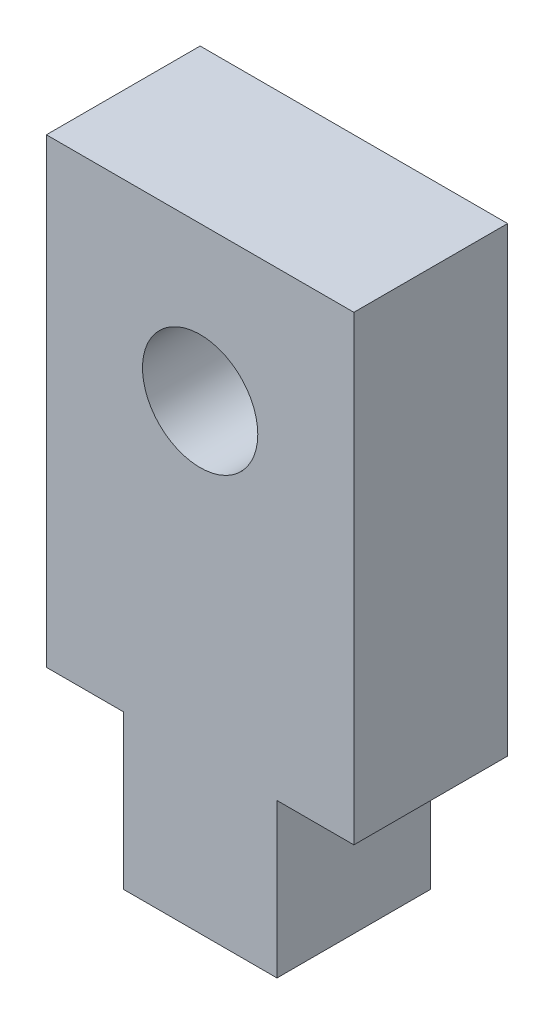
ISO-10303-21;
HEADER;
FILE_DESCRIPTION(('STEP AP214'),'2;1');
FILE_NAME('part.step','',(''),(''),'','','');
FILE_SCHEMA(('AUTOMOTIVE_DESIGN { 1 0 10303 214 1 1 1 1 }'));
ENDSEC;
DATA;
#1=APPLICATION_CONTEXT('core data for automotive mechanical design processes');
#2=APPLICATION_PROTOCOL_DEFINITION('international standard','automotive_design',2000,#1);
#3=PRODUCT_CONTEXT('',#1,'mechanical');
#4=PRODUCT('Part','Part','',(#3));
#5=PRODUCT_RELATED_PRODUCT_CATEGORY('part','',(#4));
#6=PRODUCT_DEFINITION_FORMATION('','',#4);
#7=PRODUCT_DEFINITION_CONTEXT('part definition',#1,'design');
#8=PRODUCT_DEFINITION('design','',#6,#7);
#9=PRODUCT_DEFINITION_SHAPE('','',#8);
#10=(LENGTH_UNIT() NAMED_UNIT(*) SI_UNIT(.MILLI.,.METRE.));
#11=(NAMED_UNIT(*) PLANE_ANGLE_UNIT() SI_UNIT($,.RADIAN.));
#12=(NAMED_UNIT(*) SI_UNIT($,.STERADIAN.) SOLID_ANGLE_UNIT());
#13=UNCERTAINTY_MEASURE_WITH_UNIT(LENGTH_MEASURE(1.E-05),#10,'distance_accuracy_value','');
#14=(GEOMETRIC_REPRESENTATION_CONTEXT(3) GLOBAL_UNCERTAINTY_ASSIGNED_CONTEXT((#13)) GLOBAL_UNIT_ASSIGNED_CONTEXT((#10,
#11,#12)) REPRESENTATION_CONTEXT('',''));
#15=CARTESIAN_POINT('',(0.,0.,0.));
#16=DIRECTION('',(0.,0.,1.));
#17=DIRECTION('',(1.,0.,0.));
#18=AXIS2_PLACEMENT_3D('',#15,#16,#17);
#19=CARTESIAN_POINT('',(0.,0.,5.));
#20=DIRECTION('',(0.,0.,1.));
#21=DIRECTION('',(1.,0.,0.));
#22=AXIS2_PLACEMENT_3D('',#19,#20,#21);
#23=PLANE('',#22);
#24=DIRECTION('',(0.,1.,0.));
#25=VECTOR('',#24,1.);
#26=CARTESIAN_POINT('',(5.00000000000001,7.5,5.));
#27=LINE('',#26,#25);
#28=CARTESIAN_POINT('',(5.,-7.5,5.));
#29=VERTEX_POINT('',#28);
#30=CARTESIAN_POINT('',(5.00000000000001,7.5,5.));
#31=VERTEX_POINT('',#30);
#32=EDGE_CURVE('E145',#29,#31,#27,.T.);
#33=ORIENTED_EDGE('',*,*,#32,.T.);
#34=DIRECTION('',(-1.,0.,0.));
#35=VECTOR('',#34,1.);
#36=CARTESIAN_POINT('',(-5.,7.5,5.));
#37=LINE('',#36,#35);
#38=CARTESIAN_POINT('',(-5.,7.5,5.));
#39=VERTEX_POINT('',#38);
#40=EDGE_CURVE('E93',#31,#39,#37,.T.);
#41=ORIENTED_EDGE('',*,*,#40,.T.);
#42=DIRECTION('',(0.,-1.,0.));
#43=VECTOR('',#42,1.);
#44=CARTESIAN_POINT('',(-5.,7.5,5.));
#45=LINE('',#44,#43);
#46=CARTESIAN_POINT('',(-5.00000000000001,-7.5,5.));
#47=VERTEX_POINT('',#46);
#48=EDGE_CURVE('E160',#39,#47,#45,.T.);
#49=ORIENTED_EDGE('',*,*,#48,.T.);
#50=DIRECTION('',(1.,0.,0.));
#51=VECTOR('',#50,1.);
#52=CARTESIAN_POINT('',(-5.00000000000001,-7.5,5.));
#53=LINE('',#52,#51);
#54=CARTESIAN_POINT('',(-2.5,-7.5,5.));
#55=VERTEX_POINT('',#54);
#56=EDGE_CURVE('E173',#47,#55,#53,.T.);
#57=ORIENTED_EDGE('',*,*,#56,.T.);
#58=DIRECTION('',(0.,-1.,0.));
#59=VECTOR('',#58,1.);
#60=CARTESIAN_POINT('',(-2.5,-12.5,5.));
#61=LINE('',#60,#59);
#62=CARTESIAN_POINT('',(-2.5,-12.5,5.));
#63=VERTEX_POINT('',#62);
#64=EDGE_CURVE('E112',#55,#63,#61,.T.);
#65=ORIENTED_EDGE('',*,*,#64,.T.);
#66=DIRECTION('',(1.,0.,0.));
#67=VECTOR('',#66,1.);
#68=CARTESIAN_POINT('',(-2.5,-12.5,5.));
#69=LINE('',#68,#67);
#70=CARTESIAN_POINT('',(2.5,-12.5,5.));
#71=VERTEX_POINT('',#70);
#72=EDGE_CURVE('E106',#63,#71,#69,.T.);
#73=ORIENTED_EDGE('',*,*,#72,.T.);
#74=DIRECTION('',(0.,1.,0.));
#75=VECTOR('',#74,1.);
#76=CARTESIAN_POINT('',(2.5,-12.5,5.));
#77=LINE('',#76,#75);
#78=CARTESIAN_POINT('',(2.5,-7.5,5.));
#79=VERTEX_POINT('',#78);
#80=EDGE_CURVE('E110',#71,#79,#77,.T.);
#81=ORIENTED_EDGE('',*,*,#80,.T.);
#82=DIRECTION('',(1.,0.,0.));
#83=VECTOR('',#82,1.);
#84=CARTESIAN_POINT('',(2.5,-7.5,5.));
#85=LINE('',#84,#83);
#86=EDGE_CURVE('E50',#79,#29,#85,.T.);
#87=ORIENTED_EDGE('',*,*,#86,.T.);
#88=EDGE_LOOP('',(#33,#41,#49,#57,#65,#73,#81,#87));
#89=FACE_BOUND('',#88,.T.);
#90=CARTESIAN_POINT('',(0.,2.5,5.));
#91=DIRECTION('',(0.,0.,1.));
#92=DIRECTION('',(1.,0.,0.));
#93=AXIS2_PLACEMENT_3D('',#90,#91,#92);
#94=CIRCLE('',#93,1.875);
#95=CARTESIAN_POINT('',(1.875,2.5,5.));
#96=VERTEX_POINT('',#95);
#97=EDGE_CURVE('E134',#96,#96,#94,.T.);
#98=ORIENTED_EDGE('',*,*,#97,.F.);
#99=EDGE_LOOP('',(#98));
#100=FACE_BOUND('',#99,.T.);
#101=ADVANCED_FACE('F33',(#89,#100),#23,.T.);
#102=CARTESIAN_POINT('',(0.,0.,0.));
#103=DIRECTION('',(0.,0.,1.));
#104=DIRECTION('',(1.,0.,0.));
#105=AXIS2_PLACEMENT_3D('',#102,#103,#104);
#106=PLANE('',#105);
#107=DIRECTION('',(0.,1.,0.));
#108=VECTOR('',#107,1.);
#109=CARTESIAN_POINT('',(5.00000000000001,7.5,0.));
#110=LINE('',#109,#108);
#111=CARTESIAN_POINT('',(5.,-7.5,0.));
#112=VERTEX_POINT('',#111);
#113=CARTESIAN_POINT('',(5.00000000000001,7.5,0.));
#114=VERTEX_POINT('',#113);
#115=EDGE_CURVE('E130',#112,#114,#110,.T.);
#116=ORIENTED_EDGE('',*,*,#115,.F.);
#117=DIRECTION('',(1.,0.,0.));
#118=VECTOR('',#117,1.);
#119=CARTESIAN_POINT('',(2.5,-7.5,0.));
#120=LINE('',#119,#118);
#121=CARTESIAN_POINT('',(2.5,-7.5,0.));
#122=VERTEX_POINT('',#121);
#123=EDGE_CURVE('E85',#122,#112,#120,.T.);
#124=ORIENTED_EDGE('',*,*,#123,.F.);
#125=DIRECTION('',(0.,1.,0.));
#126=VECTOR('',#125,1.);
#127=CARTESIAN_POINT('',(2.5,-12.5,0.));
#128=LINE('',#127,#126);
#129=CARTESIAN_POINT('',(2.5,-12.5,0.));
#130=VERTEX_POINT('',#129);
#131=EDGE_CURVE('E79',#130,#122,#128,.T.);
#132=ORIENTED_EDGE('',*,*,#131,.F.);
#133=DIRECTION('',(1.,0.,0.));
#134=VECTOR('',#133,1.);
#135=CARTESIAN_POINT('',(-2.5,-12.5,0.));
#136=LINE('',#135,#134);
#137=CARTESIAN_POINT('',(-2.5,-12.5,0.));
#138=VERTEX_POINT('',#137);
#139=EDGE_CURVE('E120',#138,#130,#136,.T.);
#140=ORIENTED_EDGE('',*,*,#139,.F.);
#141=DIRECTION('',(0.,-1.,0.));
#142=VECTOR('',#141,1.);
#143=CARTESIAN_POINT('',(-2.5,-12.5,0.));
#144=LINE('',#143,#142);
#145=CARTESIAN_POINT('',(-2.5,-7.5,0.));
#146=VERTEX_POINT('',#145);
#147=EDGE_CURVE('E140',#146,#138,#144,.T.);
#148=ORIENTED_EDGE('',*,*,#147,.F.);
#149=DIRECTION('',(1.,0.,0.));
#150=VECTOR('',#149,1.);
#151=CARTESIAN_POINT('',(-5.00000000000001,-7.5,0.));
#152=LINE('',#151,#150);
#153=CARTESIAN_POINT('',(-5.00000000000001,-7.5,0.));
#154=VERTEX_POINT('',#153);
#155=EDGE_CURVE('E138',#154,#146,#152,.T.);
#156=ORIENTED_EDGE('',*,*,#155,.F.);
#157=DIRECTION('',(0.,-1.,0.));
#158=VECTOR('',#157,1.);
#159=CARTESIAN_POINT('',(-5.,7.5,0.));
#160=LINE('',#159,#158);
#161=CARTESIAN_POINT('',(-5.,7.5,0.));
#162=VERTEX_POINT('',#161);
#163=EDGE_CURVE('E136',#162,#154,#160,.T.);
#164=ORIENTED_EDGE('',*,*,#163,.F.);
#165=DIRECTION('',(-1.,0.,0.));
#166=VECTOR('',#165,1.);
#167=CARTESIAN_POINT('',(-5.,7.5,0.));
#168=LINE('',#167,#166);
#169=EDGE_CURVE('E133',#114,#162,#168,.T.);
#170=ORIENTED_EDGE('',*,*,#169,.F.);
#171=EDGE_LOOP('',(#116,#124,#132,#140,#148,#156,#164,#170));
#172=FACE_BOUND('',#171,.T.);
#173=CARTESIAN_POINT('',(0.,2.5,0.));
#174=DIRECTION('',(0.,0.,1.));
#175=DIRECTION('',(1.,0.,0.));
#176=AXIS2_PLACEMENT_3D('',#173,#174,#175);
#177=CIRCLE('',#176,1.875);
#178=CARTESIAN_POINT('',(1.875,2.5,0.));
#179=VERTEX_POINT('',#178);
#180=EDGE_CURVE('E179',#179,#179,#177,.T.);
#181=ORIENTED_EDGE('',*,*,#180,.T.);
#182=EDGE_LOOP('',(#181));
#183=FACE_BOUND('',#182,.T.);
#184=ADVANCED_FACE('F164',(#172,#183),#106,.F.);
#185=CARTESIAN_POINT('',(5.00000000000001,7.5,5.));
#186=DIRECTION('',(-1.,0.,0.));
#187=DIRECTION('',(0.,-1.,0.));
#188=AXIS2_PLACEMENT_3D('',#185,#186,#187);
#189=PLANE('',#188);
#190=ORIENTED_EDGE('',*,*,#115,.T.);
#191=DIRECTION('',(0.,0.,-1.));
#192=VECTOR('',#191,1.);
#193=CARTESIAN_POINT('',(5.00000000000001,7.5,5.));
#194=LINE('',#193,#192);
#195=EDGE_CURVE('E11',#31,#114,#194,.T.);
#196=ORIENTED_EDGE('',*,*,#195,.F.);
#197=ORIENTED_EDGE('',*,*,#32,.F.);
#198=DIRECTION('',(0.,0.,-1.));
#199=VECTOR('',#198,1.);
#200=CARTESIAN_POINT('',(5.,-7.5,5.));
#201=LINE('',#200,#199);
#202=EDGE_CURVE('E126',#29,#112,#201,.T.);
#203=ORIENTED_EDGE('',*,*,#202,.T.);
#204=EDGE_LOOP('',(#190,#196,#197,#203));
#205=FACE_BOUND('',#204,.T.);
#206=ADVANCED_FACE('F35',(#205),#189,.F.);
#207=CARTESIAN_POINT('',(-5.,7.5,5.));
#208=DIRECTION('',(0.,-1.,0.));
#209=DIRECTION('',(0.,0.,-1.));
#210=AXIS2_PLACEMENT_3D('',#207,#208,#209);
#211=PLANE('',#210);
#212=ORIENTED_EDGE('',*,*,#169,.T.);
#213=DIRECTION('',(0.,0.,-1.));
#214=VECTOR('',#213,1.);
#215=CARTESIAN_POINT('',(-5.,7.5,5.));
#216=LINE('',#215,#214);
#217=EDGE_CURVE('E42',#39,#162,#216,.T.);
#218=ORIENTED_EDGE('',*,*,#217,.F.);
#219=ORIENTED_EDGE('',*,*,#40,.F.);
#220=ORIENTED_EDGE('',*,*,#195,.T.);
#221=EDGE_LOOP('',(#212,#218,#219,#220));
#222=FACE_BOUND('',#221,.T.);
#223=ADVANCED_FACE('F207',(#222),#211,.F.);
#224=CARTESIAN_POINT('',(-5.,7.5,5.));
#225=DIRECTION('',(1.,0.,0.));
#226=DIRECTION('',(0.,1.,0.));
#227=AXIS2_PLACEMENT_3D('',#224,#225,#226);
#228=PLANE('',#227);
#229=ORIENTED_EDGE('',*,*,#163,.T.);
#230=DIRECTION('',(0.,0.,-1.));
#231=VECTOR('',#230,1.);
#232=CARTESIAN_POINT('',(-5.00000000000001,-7.5,5.));
#233=LINE('',#232,#231);
#234=EDGE_CURVE('E152',#47,#154,#233,.T.);
#235=ORIENTED_EDGE('',*,*,#234,.F.);
#236=ORIENTED_EDGE('',*,*,#48,.F.);
#237=ORIENTED_EDGE('',*,*,#217,.T.);
#238=EDGE_LOOP('',(#229,#235,#236,#237));
#239=FACE_BOUND('',#238,.T.);
#240=ADVANCED_FACE('F158',(#239),#228,.F.);
#241=CARTESIAN_POINT('',(-5.00000000000001,-7.5,5.));
#242=DIRECTION('',(0.,1.,0.));
#243=DIRECTION('',(0.,0.,1.));
#244=AXIS2_PLACEMENT_3D('',#241,#242,#243);
#245=PLANE('',#244);
#246=ORIENTED_EDGE('',*,*,#155,.T.);
#247=DIRECTION('',(0.,0.,-1.));
#248=VECTOR('',#247,1.);
#249=CARTESIAN_POINT('',(-2.5,-7.5,5.));
#250=LINE('',#249,#248);
#251=EDGE_CURVE('E149',#55,#146,#250,.T.);
#252=ORIENTED_EDGE('',*,*,#251,.F.);
#253=ORIENTED_EDGE('',*,*,#56,.F.);
#254=ORIENTED_EDGE('',*,*,#234,.T.);
#255=EDGE_LOOP('',(#246,#252,#253,#254));
#256=FACE_BOUND('',#255,.T.);
#257=ADVANCED_FACE('F169',(#256),#245,.F.);
#258=CARTESIAN_POINT('',(-2.5,-12.5,5.));
#259=DIRECTION('',(1.,0.,0.));
#260=DIRECTION('',(0.,0.,-1.));
#261=AXIS2_PLACEMENT_3D('',#258,#259,#260);
#262=PLANE('',#261);
#263=ORIENTED_EDGE('',*,*,#147,.T.);
#264=DIRECTION('',(0.,0.,-1.));
#265=VECTOR('',#264,1.);
#266=CARTESIAN_POINT('',(-2.5,-12.5,5.));
#267=LINE('',#266,#265);
#268=EDGE_CURVE('E121',#63,#138,#267,.T.);
#269=ORIENTED_EDGE('',*,*,#268,.F.);
#270=ORIENTED_EDGE('',*,*,#64,.F.);
#271=ORIENTED_EDGE('',*,*,#251,.T.);
#272=EDGE_LOOP('',(#263,#269,#270,#271));
#273=FACE_BOUND('',#272,.T.);
#274=ADVANCED_FACE('F172',(#273),#262,.F.);
#275=CARTESIAN_POINT('',(-2.5,-12.5,5.));
#276=DIRECTION('',(0.,1.,0.));
#277=DIRECTION('',(0.,0.,1.));
#278=AXIS2_PLACEMENT_3D('',#275,#276,#277);
#279=PLANE('',#278);
#280=ORIENTED_EDGE('',*,*,#139,.T.);
#281=DIRECTION('',(0.,0.,-1.));
#282=VECTOR('',#281,1.);
#283=CARTESIAN_POINT('',(2.5,-12.5,5.));
#284=LINE('',#283,#282);
#285=EDGE_CURVE('E117',#71,#130,#284,.T.);
#286=ORIENTED_EDGE('',*,*,#285,.F.);
#287=ORIENTED_EDGE('',*,*,#72,.F.);
#288=ORIENTED_EDGE('',*,*,#268,.T.);
#289=EDGE_LOOP('',(#280,#286,#287,#288));
#290=FACE_BOUND('',#289,.T.);
#291=ADVANCED_FACE('F118',(#290),#279,.F.);
#292=CARTESIAN_POINT('',(2.5,-12.5,5.));
#293=DIRECTION('',(-1.,0.,0.));
#294=DIRECTION('',(0.,-1.,0.));
#295=AXIS2_PLACEMENT_3D('',#292,#293,#294);
#296=PLANE('',#295);
#297=ORIENTED_EDGE('',*,*,#131,.T.);
#298=DIRECTION('',(0.,0.,-1.));
#299=VECTOR('',#298,1.);
#300=CARTESIAN_POINT('',(2.5,-7.5,5.));
#301=LINE('',#300,#299);
#302=EDGE_CURVE('E122',#79,#122,#301,.T.);
#303=ORIENTED_EDGE('',*,*,#302,.F.);
#304=ORIENTED_EDGE('',*,*,#80,.F.);
#305=ORIENTED_EDGE('',*,*,#285,.T.);
#306=EDGE_LOOP('',(#297,#303,#304,#305));
#307=FACE_BOUND('',#306,.T.);
#308=ADVANCED_FACE('F124',(#307),#296,.F.);
#309=CARTESIAN_POINT('',(2.5,-7.5,5.));
#310=DIRECTION('',(0.,1.,0.));
#311=DIRECTION('',(0.,0.,1.));
#312=AXIS2_PLACEMENT_3D('',#309,#310,#311);
#313=PLANE('',#312);
#314=ORIENTED_EDGE('',*,*,#123,.T.);
#315=ORIENTED_EDGE('',*,*,#202,.F.);
#316=ORIENTED_EDGE('',*,*,#86,.F.);
#317=ORIENTED_EDGE('',*,*,#302,.T.);
#318=EDGE_LOOP('',(#314,#315,#316,#317));
#319=FACE_BOUND('',#318,.T.);
#320=ADVANCED_FACE('F195',(#319),#313,.F.);
#321=CARTESIAN_POINT('',(0.,2.5,5.));
#322=DIRECTION('',(0.,0.,-1.));
#323=DIRECTION('',(-1.,0.,0.));
#324=AXIS2_PLACEMENT_3D('',#321,#322,#323);
#325=CYLINDRICAL_SURFACE('',#324,1.875);
#326=ORIENTED_EDGE('',*,*,#97,.T.);
#327=EDGE_LOOP('',(#326));
#328=FACE_BOUND('',#327,.T.);
#329=ORIENTED_EDGE('',*,*,#180,.F.);
#330=EDGE_LOOP('',(#329));
#331=FACE_BOUND('',#330,.T.);
#332=ADVANCED_FACE('F185',(#328,#331),#325,.F.);
#333=CLOSED_SHELL('',(#101,#184,#206,#223,#240,#257,#274,#291,#308,#320,#332));
#334=MANIFOLD_SOLID_BREP('B2',#333);
#335=ADVANCED_BREP_SHAPE_REPRESENTATION('',(#18,#334),#14);
#336=SHAPE_DEFINITION_REPRESENTATION(#9,#335);
ENDSEC;
END-ISO-10303-21;
